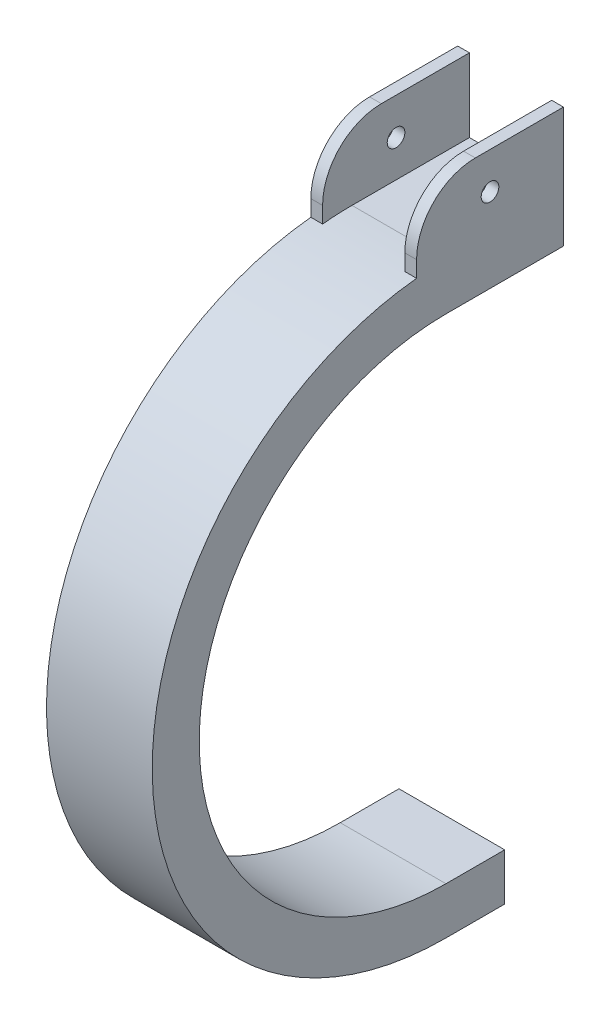
ISO-10303-21;
HEADER;
FILE_DESCRIPTION(('STEP AP214'),'2;1');
FILE_NAME('part.step','',(''),(''),'','','');
FILE_SCHEMA(('AUTOMOTIVE_DESIGN { 1 0 10303 214 1 1 1 1 }'));
ENDSEC;
DATA;
#1=APPLICATION_CONTEXT('core data for automotive mechanical design processes');
#2=APPLICATION_PROTOCOL_DEFINITION('international standard','automotive_design',2000,#1);
#3=PRODUCT_CONTEXT('',#1,'mechanical');
#4=PRODUCT('Part','Part','',(#3));
#5=PRODUCT_RELATED_PRODUCT_CATEGORY('part','',(#4));
#6=PRODUCT_DEFINITION_FORMATION('','',#4);
#7=PRODUCT_DEFINITION_CONTEXT('part definition',#1,'design');
#8=PRODUCT_DEFINITION('design','',#6,#7);
#9=PRODUCT_DEFINITION_SHAPE('','',#8);
#10=(LENGTH_UNIT() NAMED_UNIT(*) SI_UNIT(.MILLI.,.METRE.));
#11=(NAMED_UNIT(*) PLANE_ANGLE_UNIT() SI_UNIT($,.RADIAN.));
#12=(NAMED_UNIT(*) SI_UNIT($,.STERADIAN.) SOLID_ANGLE_UNIT());
#13=UNCERTAINTY_MEASURE_WITH_UNIT(LENGTH_MEASURE(1.E-05),#10,'distance_accuracy_value','');
#14=(GEOMETRIC_REPRESENTATION_CONTEXT(3) GLOBAL_UNCERTAINTY_ASSIGNED_CONTEXT((#13)) GLOBAL_UNIT_ASSIGNED_CONTEXT((#10,
#11,#12)) REPRESENTATION_CONTEXT('',''));
#15=CARTESIAN_POINT('',(0.,0.,0.));
#16=DIRECTION('',(0.,0.,1.));
#17=DIRECTION('',(1.,0.,0.));
#18=AXIS2_PLACEMENT_3D('',#15,#16,#17);
#19=CARTESIAN_POINT('',(18.,50.,0.));
#20=DIRECTION('',(0.,-1.,0.));
#21=DIRECTION('',(0.,0.,-1.));
#22=AXIS2_PLACEMENT_3D('',#19,#20,#21);
#23=PLANE('',#22);
#24=DIRECTION('',(-1.,0.,0.));
#25=VECTOR('',#24,1.);
#26=CARTESIAN_POINT('',(18.,50.,-20.));
#27=LINE('',#26,#25);
#28=CARTESIAN_POINT('',(16.,50.,-20.));
#29=VERTEX_POINT('',#28);
#30=CARTESIAN_POINT('',(2.,50.,-20.));
#31=VERTEX_POINT('',#30);
#32=EDGE_CURVE('E238',#29,#31,#27,.T.);
#33=ORIENTED_EDGE('',*,*,#32,.T.);
#34=DIRECTION('',(0.,0.,1.));
#35=VECTOR('',#34,1.);
#36=CARTESIAN_POINT('',(2.,50.,0.));
#37=LINE('',#36,#35);
#38=CARTESIAN_POINT('',(2.,50.,0.));
#39=VERTEX_POINT('',#38);
#40=EDGE_CURVE('E165',#31,#39,#37,.T.);
#41=ORIENTED_EDGE('',*,*,#40,.T.);
#42=DIRECTION('',(-1.,0.,0.));
#43=VECTOR('',#42,1.);
#44=CARTESIAN_POINT('',(18.,50.,0.));
#45=LINE('',#44,#43);
#46=CARTESIAN_POINT('',(16.,50.,0.));
#47=VERTEX_POINT('',#46);
#48=EDGE_CURVE('E235',#47,#39,#45,.T.);
#49=ORIENTED_EDGE('',*,*,#48,.F.);
#50=DIRECTION('',(0.,0.,1.));
#51=VECTOR('',#50,1.);
#52=CARTESIAN_POINT('',(16.,50.,0.));
#53=LINE('',#52,#51);
#54=EDGE_CURVE('E198',#29,#47,#53,.T.);
#55=ORIENTED_EDGE('',*,*,#54,.F.);
#56=EDGE_LOOP('',(#33,#41,#49,#55));
#57=FACE_BOUND('',#56,.T.);
#58=ADVANCED_FACE('F33',(#57),#23,.F.);
#59=CARTESIAN_POINT('',(18.,-42.,-10.));
#60=DIRECTION('',(0.,0.,1.));
#61=DIRECTION('',(0.,-1.,0.));
#62=AXIS2_PLACEMENT_3D('',#59,#60,#61);
#63=PLANE('',#62);
#64=DIRECTION('',(0.,1.,0.));
#65=VECTOR('',#64,1.);
#66=CARTESIAN_POINT('',(0.,-42.,-10.));
#67=LINE('',#66,#65);
#68=CARTESIAN_POINT('',(0.,-50.,-10.));
#69=VERTEX_POINT('',#68);
#70=CARTESIAN_POINT('',(0.,-42.,-10.));
#71=VERTEX_POINT('',#70);
#72=EDGE_CURVE('E200',#69,#71,#67,.T.);
#73=ORIENTED_EDGE('',*,*,#72,.T.);
#74=DIRECTION('',(-1.,0.,0.));
#75=VECTOR('',#74,1.);
#76=CARTESIAN_POINT('',(18.,-42.,-10.));
#77=LINE('',#76,#75);
#78=CARTESIAN_POINT('',(18.,-42.,-10.));
#79=VERTEX_POINT('',#78);
#80=EDGE_CURVE('E248',#79,#71,#77,.T.);
#81=ORIENTED_EDGE('',*,*,#80,.F.);
#82=DIRECTION('',(0.,1.,0.));
#83=VECTOR('',#82,1.);
#84=CARTESIAN_POINT('',(18.,-42.,-10.));
#85=LINE('',#84,#83);
#86=CARTESIAN_POINT('',(18.,-50.,-10.));
#87=VERTEX_POINT('',#86);
#88=EDGE_CURVE('E201',#87,#79,#85,.T.);
#89=ORIENTED_EDGE('',*,*,#88,.F.);
#90=DIRECTION('',(-1.,0.,0.));
#91=VECTOR('',#90,1.);
#92=CARTESIAN_POINT('',(18.,-50.,-10.));
#93=LINE('',#92,#91);
#94=EDGE_CURVE('E217',#87,#69,#93,.T.);
#95=ORIENTED_EDGE('',*,*,#94,.T.);
#96=EDGE_LOOP('',(#73,#81,#89,#95));
#97=FACE_BOUND('',#96,.T.);
#98=ADVANCED_FACE('F294',(#97),#63,.F.);
#99=CARTESIAN_POINT('',(18.,-42.,0.));
#100=DIRECTION('',(0.,-1.,0.));
#101=DIRECTION('',(0.,0.,-1.));
#102=AXIS2_PLACEMENT_3D('',#99,#100,#101);
#103=PLANE('',#102);
#104=DIRECTION('',(0.,0.,1.));
#105=VECTOR('',#104,1.);
#106=CARTESIAN_POINT('',(0.,-42.,0.));
#107=LINE('',#106,#105);
#108=CARTESIAN_POINT('',(0.,-42.,0.));
#109=VERTEX_POINT('',#108);
#110=EDGE_CURVE('E220',#71,#109,#107,.T.);
#111=ORIENTED_EDGE('',*,*,#110,.T.);
#112=DIRECTION('',(-1.,0.,0.));
#113=VECTOR('',#112,1.);
#114=CARTESIAN_POINT('',(18.,-42.,0.));
#115=LINE('',#114,#113);
#116=CARTESIAN_POINT('',(18.,-42.,0.));
#117=VERTEX_POINT('',#116);
#118=EDGE_CURVE('E245',#117,#109,#115,.T.);
#119=ORIENTED_EDGE('',*,*,#118,.F.);
#120=DIRECTION('',(0.,0.,1.));
#121=VECTOR('',#120,1.);
#122=CARTESIAN_POINT('',(18.,-42.,0.));
#123=LINE('',#122,#121);
#124=EDGE_CURVE('E204',#79,#117,#123,.T.);
#125=ORIENTED_EDGE('',*,*,#124,.F.);
#126=ORIENTED_EDGE('',*,*,#80,.T.);
#127=EDGE_LOOP('',(#111,#119,#125,#126));
#128=FACE_BOUND('',#127,.T.);
#129=ADVANCED_FACE('F300',(#128),#103,.F.);
#130=CARTESIAN_POINT('',(18.,0.,0.));
#131=DIRECTION('',(-1.,0.,0.));
#132=DIRECTION('',(0.,0.,1.));
#133=AXIS2_PLACEMENT_3D('',#130,#131,#132);
#134=CYLINDRICAL_SURFACE('',#133,42.);
#135=CARTESIAN_POINT('',(0.,0.,0.));
#136=DIRECTION('',(-1.,0.,0.));
#137=DIRECTION('',(0.,0.,-1.));
#138=AXIS2_PLACEMENT_3D('',#135,#136,#137);
#139=CIRCLE('',#138,42.);
#140=CARTESIAN_POINT('',(0.,42.,0.));
#141=VERTEX_POINT('',#140);
#142=EDGE_CURVE('E222',#109,#141,#139,.T.);
#143=ORIENTED_EDGE('',*,*,#142,.T.);
#144=DIRECTION('',(-1.,0.,0.));
#145=VECTOR('',#144,1.);
#146=CARTESIAN_POINT('',(18.,42.,0.));
#147=LINE('',#146,#145);
#148=CARTESIAN_POINT('',(18.,42.,0.));
#149=VERTEX_POINT('',#148);
#150=EDGE_CURVE('E242',#149,#141,#147,.T.);
#151=ORIENTED_EDGE('',*,*,#150,.F.);
#152=CARTESIAN_POINT('',(18.,0.,0.));
#153=DIRECTION('',(-1.,0.,0.));
#154=DIRECTION('',(0.,0.,-1.));
#155=AXIS2_PLACEMENT_3D('',#152,#153,#154);
#156=CIRCLE('',#155,42.);
#157=EDGE_CURVE('E207',#117,#149,#156,.T.);
#158=ORIENTED_EDGE('',*,*,#157,.F.);
#159=ORIENTED_EDGE('',*,*,#118,.T.);
#160=EDGE_LOOP('',(#143,#151,#158,#159));
#161=FACE_BOUND('',#160,.T.);
#162=ADVANCED_FACE('F311',(#161),#134,.F.);
#163=CARTESIAN_POINT('',(18.,42.,0.));
#164=DIRECTION('',(0.,1.,0.));
#165=DIRECTION('',(0.,0.,1.));
#166=AXIS2_PLACEMENT_3D('',#163,#164,#165);
#167=PLANE('',#166);
#168=DIRECTION('',(0.,0.,-1.));
#169=VECTOR('',#168,1.);
#170=CARTESIAN_POINT('',(0.,42.,0.));
#171=LINE('',#170,#169);
#172=CARTESIAN_POINT('',(0.,42.,-20.));
#173=VERTEX_POINT('',#172);
#174=EDGE_CURVE('E224',#141,#173,#171,.T.);
#175=ORIENTED_EDGE('',*,*,#174,.T.);
#176=DIRECTION('',(-1.,0.,0.));
#177=VECTOR('',#176,1.);
#178=CARTESIAN_POINT('',(18.,42.,-20.));
#179=LINE('',#178,#177);
#180=CARTESIAN_POINT('',(18.,42.,-20.));
#181=VERTEX_POINT('',#180);
#182=EDGE_CURVE('E240',#181,#173,#179,.T.);
#183=ORIENTED_EDGE('',*,*,#182,.F.);
#184=DIRECTION('',(0.,0.,-1.));
#185=VECTOR('',#184,1.);
#186=CARTESIAN_POINT('',(18.,42.,0.));
#187=LINE('',#186,#185);
#188=EDGE_CURVE('E209',#149,#181,#187,.T.);
#189=ORIENTED_EDGE('',*,*,#188,.F.);
#190=ORIENTED_EDGE('',*,*,#150,.T.);
#191=EDGE_LOOP('',(#175,#183,#189,#190));
#192=FACE_BOUND('',#191,.T.);
#193=ADVANCED_FACE('F308',(#192),#167,.F.);
#194=CARTESIAN_POINT('',(18.,50.,-20.));
#195=DIRECTION('',(0.,0.,1.));
#196=DIRECTION('',(1.,0.,0.));
#197=AXIS2_PLACEMENT_3D('',#194,#195,#196);
#198=PLANE('',#197);
#199=DIRECTION('',(0.,1.,0.));
#200=VECTOR('',#199,1.);
#201=CARTESIAN_POINT('',(0.,50.,-20.));
#202=LINE('',#201,#200);
#203=CARTESIAN_POINT('',(0.,62.5,-20.));
#204=VERTEX_POINT('',#203);
#205=EDGE_CURVE('E159',#173,#204,#202,.T.);
#206=ORIENTED_EDGE('',*,*,#205,.T.);
#207=DIRECTION('',(-1.,0.,0.));
#208=VECTOR('',#207,1.);
#209=CARTESIAN_POINT('',(2.,62.5,-20.));
#210=LINE('',#209,#208);
#211=CARTESIAN_POINT('',(2.,62.5,-20.));
#212=VERTEX_POINT('',#211);
#213=EDGE_CURVE('E145',#212,#204,#210,.T.);
#214=ORIENTED_EDGE('',*,*,#213,.F.);
#215=DIRECTION('',(0.,-1.,0.));
#216=VECTOR('',#215,1.);
#217=CARTESIAN_POINT('',(2.,46.,-20.));
#218=LINE('',#217,#216);
#219=EDGE_CURVE('E156',#212,#31,#218,.T.);
#220=ORIENTED_EDGE('',*,*,#219,.T.);
#221=ORIENTED_EDGE('',*,*,#32,.F.);
#222=DIRECTION('',(0.,1.,0.));
#223=VECTOR('',#222,1.);
#224=CARTESIAN_POINT('',(16.,46.,-20.));
#225=LINE('',#224,#223);
#226=CARTESIAN_POINT('',(16.,62.5,-20.));
#227=VERTEX_POINT('',#226);
#228=EDGE_CURVE('E181',#29,#227,#225,.T.);
#229=ORIENTED_EDGE('',*,*,#228,.T.);
#230=DIRECTION('',(1.,0.,0.));
#231=VECTOR('',#230,1.);
#232=CARTESIAN_POINT('',(16.,62.5,-20.));
#233=LINE('',#232,#231);
#234=CARTESIAN_POINT('',(18.,62.5,-20.));
#235=VERTEX_POINT('',#234);
#236=EDGE_CURVE('E189',#227,#235,#233,.T.);
#237=ORIENTED_EDGE('',*,*,#236,.T.);
#238=DIRECTION('',(0.,1.,0.));
#239=VECTOR('',#238,1.);
#240=CARTESIAN_POINT('',(18.,50.,-20.));
#241=LINE('',#240,#239);
#242=EDGE_CURVE('E211',#181,#235,#241,.T.);
#243=ORIENTED_EDGE('',*,*,#242,.F.);
#244=ORIENTED_EDGE('',*,*,#182,.T.);
#245=EDGE_LOOP('',(#206,#214,#220,#221,#229,#237,#243,#244));
#246=FACE_BOUND('',#245,.T.);
#247=ADVANCED_FACE('F154',(#246),#198,.F.);
#248=CARTESIAN_POINT('',(18.,0.,0.));
#249=DIRECTION('',(-1.,0.,0.));
#250=DIRECTION('',(0.,0.,1.));
#251=AXIS2_PLACEMENT_3D('',#248,#249,#250);
#252=CYLINDRICAL_SURFACE('',#251,50.);
#253=CARTESIAN_POINT('',(2.,0.,0.));
#254=DIRECTION('',(1.,0.,0.));
#255=DIRECTION('',(0.,0.,-1.));
#256=AXIS2_PLACEMENT_3D('',#253,#254,#255);
#257=CIRCLE('',#256,50.);
#258=CARTESIAN_POINT('',(2.,49.749371855331,5.));
#259=VERTEX_POINT('',#258);
#260=EDGE_CURVE('E254',#39,#259,#257,.T.);
#261=ORIENTED_EDGE('',*,*,#260,.T.);
#262=DIRECTION('',(-1.,0.,0.));
#263=VECTOR('',#262,1.);
#264=CARTESIAN_POINT('',(18.,49.749371855331,5.));
#265=LINE('',#264,#263);
#266=CARTESIAN_POINT('',(0.,49.749371855331,5.));
#267=VERTEX_POINT('',#266);
#268=EDGE_CURVE('E160',#259,#267,#265,.T.);
#269=ORIENTED_EDGE('',*,*,#268,.T.);
#270=CARTESIAN_POINT('',(0.,0.,0.));
#271=DIRECTION('',(1.,0.,0.));
#272=DIRECTION('',(0.,0.,-1.));
#273=AXIS2_PLACEMENT_3D('',#270,#271,#272);
#274=CIRCLE('',#273,50.);
#275=CARTESIAN_POINT('',(0.,-50.,0.));
#276=VERTEX_POINT('',#275);
#277=EDGE_CURVE('E227',#267,#276,#274,.T.);
#278=ORIENTED_EDGE('',*,*,#277,.T.);
#279=DIRECTION('',(-1.,0.,0.));
#280=VECTOR('',#279,1.);
#281=CARTESIAN_POINT('',(18.,-50.,0.));
#282=LINE('',#281,#280);
#283=CARTESIAN_POINT('',(18.,-50.,0.));
#284=VERTEX_POINT('',#283);
#285=EDGE_CURVE('E232',#284,#276,#282,.T.);
#286=ORIENTED_EDGE('',*,*,#285,.F.);
#287=CARTESIAN_POINT('',(18.,0.,0.));
#288=DIRECTION('',(1.,0.,0.));
#289=DIRECTION('',(0.,0.,-1.));
#290=AXIS2_PLACEMENT_3D('',#287,#288,#289);
#291=CIRCLE('',#290,50.);
#292=CARTESIAN_POINT('',(18.,49.749371855331,5.));
#293=VERTEX_POINT('',#292);
#294=EDGE_CURVE('E213',#293,#284,#291,.T.);
#295=ORIENTED_EDGE('',*,*,#294,.F.);
#296=DIRECTION('',(-1.,0.,0.));
#297=VECTOR('',#296,1.);
#298=CARTESIAN_POINT('',(18.,49.749371855331,5.));
#299=LINE('',#298,#297);
#300=CARTESIAN_POINT('',(16.,49.749371855331,5.));
#301=VERTEX_POINT('',#300);
#302=EDGE_CURVE('E195',#293,#301,#299,.T.);
#303=ORIENTED_EDGE('',*,*,#302,.T.);
#304=CARTESIAN_POINT('',(16.,0.,0.));
#305=DIRECTION('',(1.,0.,0.));
#306=DIRECTION('',(0.,0.,-1.));
#307=AXIS2_PLACEMENT_3D('',#304,#305,#306);
#308=CIRCLE('',#307,50.);
#309=EDGE_CURVE('E251',#47,#301,#308,.T.);
#310=ORIENTED_EDGE('',*,*,#309,.F.);
#311=ORIENTED_EDGE('',*,*,#48,.T.);
#312=EDGE_LOOP('',(#261,#269,#278,#286,#295,#303,#310,#311));
#313=FACE_BOUND('',#312,.T.);
#314=ADVANCED_FACE('F285',(#313),#252,.T.);
#315=CARTESIAN_POINT('',(18.,-50.,0.));
#316=DIRECTION('',(0.,1.,0.));
#317=DIRECTION('',(0.,0.,1.));
#318=AXIS2_PLACEMENT_3D('',#315,#316,#317);
#319=PLANE('',#318);
#320=DIRECTION('',(0.,0.,-1.));
#321=VECTOR('',#320,1.);
#322=CARTESIAN_POINT('',(0.,-50.,0.));
#323=LINE('',#322,#321);
#324=EDGE_CURVE('E205',#276,#69,#323,.T.);
#325=ORIENTED_EDGE('',*,*,#324,.T.);
#326=ORIENTED_EDGE('',*,*,#94,.F.);
#327=DIRECTION('',(0.,0.,-1.));
#328=VECTOR('',#327,1.);
#329=CARTESIAN_POINT('',(18.,-50.,0.));
#330=LINE('',#329,#328);
#331=EDGE_CURVE('E215',#284,#87,#330,.T.);
#332=ORIENTED_EDGE('',*,*,#331,.F.);
#333=ORIENTED_EDGE('',*,*,#285,.T.);
#334=EDGE_LOOP('',(#325,#326,#332,#333));
#335=FACE_BOUND('',#334,.T.);
#336=ADVANCED_FACE('F337',(#335),#319,.F.);
#337=CARTESIAN_POINT('',(18.,0.,0.));
#338=DIRECTION('',(1.,0.,0.));
#339=DIRECTION('',(0.,0.,-1.));
#340=AXIS2_PLACEMENT_3D('',#337,#338,#339);
#341=PLANE('',#340);
#342=CARTESIAN_POINT('',(18.,56.25,-7.5));
#343=DIRECTION('',(1.,0.,0.));
#344=DIRECTION('',(0.,0.,-1.));
#345=AXIS2_PLACEMENT_3D('',#342,#343,#344);
#346=CIRCLE('',#345,1.5);
#347=CARTESIAN_POINT('',(18.,56.25,-9.));
#348=VERTEX_POINT('',#347);
#349=EDGE_CURVE('E173',#348,#348,#346,.T.);
#350=ORIENTED_EDGE('',*,*,#349,.F.);
#351=EDGE_LOOP('',(#350));
#352=FACE_BOUND('',#351,.T.);
#353=DIRECTION('',(0.,0.,1.));
#354=VECTOR('',#353,1.);
#355=CARTESIAN_POINT('',(18.,62.5,-20.));
#356=LINE('',#355,#354);
#357=CARTESIAN_POINT('',(18.,62.5,-5.));
#358=VERTEX_POINT('',#357);
#359=EDGE_CURVE('E180',#235,#358,#356,.T.);
#360=ORIENTED_EDGE('',*,*,#359,.T.);
#361=CARTESIAN_POINT('',(18.,52.5,-5.));
#362=DIRECTION('',(1.,0.,0.));
#363=DIRECTION('',(0.,0.,-1.));
#364=AXIS2_PLACEMENT_3D('',#361,#362,#363);
#365=CIRCLE('',#364,10.);
#366=CARTESIAN_POINT('',(18.,52.5,5.));
#367=VERTEX_POINT('',#366);
#368=EDGE_CURVE('E264',#358,#367,#365,.T.);
#369=ORIENTED_EDGE('',*,*,#368,.T.);
#370=DIRECTION('',(0.,-1.,0.));
#371=VECTOR('',#370,1.);
#372=CARTESIAN_POINT('',(18.,46.,5.));
#373=LINE('',#372,#371);
#374=EDGE_CURVE('E184',#367,#293,#373,.T.);
#375=ORIENTED_EDGE('',*,*,#374,.T.);
#376=ORIENTED_EDGE('',*,*,#294,.T.);
#377=ORIENTED_EDGE('',*,*,#331,.T.);
#378=ORIENTED_EDGE('',*,*,#88,.T.);
#379=ORIENTED_EDGE('',*,*,#124,.T.);
#380=ORIENTED_EDGE('',*,*,#157,.T.);
#381=ORIENTED_EDGE('',*,*,#188,.T.);
#382=ORIENTED_EDGE('',*,*,#242,.T.);
#383=EDGE_LOOP('',(#360,#369,#375,#376,#377,#378,#379,#380,#381,#382));
#384=FACE_BOUND('',#383,.T.);
#385=ADVANCED_FACE('F332',(#352,#384),#341,.T.);
#386=CARTESIAN_POINT('',(0.,0.,0.));
#387=DIRECTION('',(1.,0.,0.));
#388=DIRECTION('',(0.,0.,-1.));
#389=AXIS2_PLACEMENT_3D('',#386,#387,#388);
#390=PLANE('',#389);
#391=CARTESIAN_POINT('',(0.,56.25,-7.5));
#392=DIRECTION('',(-1.,0.,0.));
#393=DIRECTION('',(0.,0.,1.));
#394=AXIS2_PLACEMENT_3D('',#391,#392,#393);
#395=CIRCLE('',#394,1.5);
#396=CARTESIAN_POINT('',(0.,56.25,-6.));
#397=VERTEX_POINT('',#396);
#398=EDGE_CURVE('E261',#397,#397,#395,.T.);
#399=ORIENTED_EDGE('',*,*,#398,.F.);
#400=EDGE_LOOP('',(#399));
#401=FACE_BOUND('',#400,.T.);
#402=DIRECTION('',(0.,1.,0.));
#403=VECTOR('',#402,1.);
#404=CARTESIAN_POINT('',(0.,46.,5.));
#405=LINE('',#404,#403);
#406=CARTESIAN_POINT('',(0.,52.5,5.));
#407=VERTEX_POINT('',#406);
#408=EDGE_CURVE('E170',#267,#407,#405,.T.);
#409=ORIENTED_EDGE('',*,*,#408,.T.);
#410=CARTESIAN_POINT('',(0.,52.5,-5.));
#411=DIRECTION('',(1.,0.,0.));
#412=DIRECTION('',(0.,0.,-1.));
#413=AXIS2_PLACEMENT_3D('',#410,#411,#412);
#414=CIRCLE('',#413,10.);
#415=CARTESIAN_POINT('',(0.,62.5,-5.));
#416=VERTEX_POINT('',#415);
#417=EDGE_CURVE('E55',#407,#416,#414,.F.);
#418=ORIENTED_EDGE('',*,*,#417,.T.);
#419=DIRECTION('',(0.,0.,-1.));
#420=VECTOR('',#419,1.);
#421=CARTESIAN_POINT('',(0.,62.5,-20.));
#422=LINE('',#421,#420);
#423=EDGE_CURVE('E166',#416,#204,#422,.T.);
#424=ORIENTED_EDGE('',*,*,#423,.T.);
#425=ORIENTED_EDGE('',*,*,#205,.F.);
#426=ORIENTED_EDGE('',*,*,#174,.F.);
#427=ORIENTED_EDGE('',*,*,#142,.F.);
#428=ORIENTED_EDGE('',*,*,#110,.F.);
#429=ORIENTED_EDGE('',*,*,#72,.F.);
#430=ORIENTED_EDGE('',*,*,#324,.F.);
#431=ORIENTED_EDGE('',*,*,#277,.F.);
#432=EDGE_LOOP('',(#409,#418,#424,#425,#426,#427,#428,#429,#430,#431));
#433=FACE_BOUND('',#432,.T.);
#434=ADVANCED_FACE('F280',(#401,#433),#390,.F.);
#435=CARTESIAN_POINT('',(16.,46.,5.));
#436=DIRECTION('',(0.,0.,1.));
#437=DIRECTION('',(1.,0.,0.));
#438=AXIS2_PLACEMENT_3D('',#435,#436,#437);
#439=PLANE('',#438);
#440=ORIENTED_EDGE('',*,*,#374,.F.);
#441=DIRECTION('',(1.,0.,0.));
#442=VECTOR('',#441,1.);
#443=CARTESIAN_POINT('',(16.,52.5,5.));
#444=LINE('',#443,#442);
#445=CARTESIAN_POINT('',(16.,52.5,5.));
#446=VERTEX_POINT('',#445);
#447=EDGE_CURVE('E266',#367,#446,#444,.F.);
#448=ORIENTED_EDGE('',*,*,#447,.T.);
#449=DIRECTION('',(0.,-1.,0.));
#450=VECTOR('',#449,1.);
#451=CARTESIAN_POINT('',(16.,46.,5.));
#452=LINE('',#451,#450);
#453=EDGE_CURVE('E187',#446,#301,#452,.T.);
#454=ORIENTED_EDGE('',*,*,#453,.T.);
#455=ORIENTED_EDGE('',*,*,#302,.F.);
#456=EDGE_LOOP('',(#440,#448,#454,#455));
#457=FACE_BOUND('',#456,.T.);
#458=ADVANCED_FACE('F344',(#457),#439,.T.);
#459=CARTESIAN_POINT('',(16.,62.5,-20.));
#460=DIRECTION('',(0.,1.,0.));
#461=DIRECTION('',(0.,0.,1.));
#462=AXIS2_PLACEMENT_3D('',#459,#460,#461);
#463=PLANE('',#462);
#464=DIRECTION('',(0.,0.,1.));
#465=VECTOR('',#464,1.);
#466=CARTESIAN_POINT('',(16.,62.5,-20.));
#467=LINE('',#466,#465);
#468=CARTESIAN_POINT('',(16.,62.5,-5.));
#469=VERTEX_POINT('',#468);
#470=EDGE_CURVE('E183',#227,#469,#467,.T.);
#471=ORIENTED_EDGE('',*,*,#470,.T.);
#472=DIRECTION('',(1.,0.,0.));
#473=VECTOR('',#472,1.);
#474=CARTESIAN_POINT('',(16.,62.5,-5.));
#475=LINE('',#474,#473);
#476=EDGE_CURVE('E256',#469,#358,#475,.T.);
#477=ORIENTED_EDGE('',*,*,#476,.T.);
#478=ORIENTED_EDGE('',*,*,#359,.F.);
#479=ORIENTED_EDGE('',*,*,#236,.F.);
#480=EDGE_LOOP('',(#471,#477,#478,#479));
#481=FACE_BOUND('',#480,.T.);
#482=ADVANCED_FACE('F353',(#481),#463,.T.);
#483=CARTESIAN_POINT('',(16.,0.,0.));
#484=DIRECTION('',(1.,0.,0.));
#485=DIRECTION('',(0.,0.,-1.));
#486=AXIS2_PLACEMENT_3D('',#483,#484,#485);
#487=PLANE('',#486);
#488=CARTESIAN_POINT('',(16.,56.25,-7.5));
#489=DIRECTION('',(1.,0.,0.));
#490=DIRECTION('',(0.,0.,-1.));
#491=AXIS2_PLACEMENT_3D('',#488,#489,#490);
#492=CIRCLE('',#491,1.5);
#493=CARTESIAN_POINT('',(16.,56.25,-9.));
#494=VERTEX_POINT('',#493);
#495=EDGE_CURVE('E260',#494,#494,#492,.T.);
#496=ORIENTED_EDGE('',*,*,#495,.T.);
#497=EDGE_LOOP('',(#496));
#498=FACE_BOUND('',#497,.T.);
#499=ORIENTED_EDGE('',*,*,#453,.F.);
#500=CARTESIAN_POINT('',(16.,52.5,-5.));
#501=DIRECTION('',(1.,0.,0.));
#502=DIRECTION('',(0.,0.,-1.));
#503=AXIS2_PLACEMENT_3D('',#500,#501,#502);
#504=CIRCLE('',#503,10.);
#505=EDGE_CURVE('E268',#446,#469,#504,.F.);
#506=ORIENTED_EDGE('',*,*,#505,.T.);
#507=ORIENTED_EDGE('',*,*,#470,.F.);
#508=ORIENTED_EDGE('',*,*,#228,.F.);
#509=ORIENTED_EDGE('',*,*,#54,.T.);
#510=ORIENTED_EDGE('',*,*,#309,.T.);
#511=EDGE_LOOP('',(#499,#506,#507,#508,#509,#510));
#512=FACE_BOUND('',#511,.T.);
#513=ADVANCED_FACE('F348',(#498,#512),#487,.F.);
#514=CARTESIAN_POINT('',(2.,46.,5.));
#515=DIRECTION('',(0.,0.,1.));
#516=DIRECTION('',(1.,0.,0.));
#517=AXIS2_PLACEMENT_3D('',#514,#515,#516);
#518=PLANE('',#517);
#519=DIRECTION('',(0.,1.,0.));
#520=VECTOR('',#519,1.);
#521=CARTESIAN_POINT('',(2.,46.,5.));
#522=LINE('',#521,#520);
#523=CARTESIAN_POINT('',(2.,52.5,5.));
#524=VERTEX_POINT('',#523);
#525=EDGE_CURVE('E149',#259,#524,#522,.T.);
#526=ORIENTED_EDGE('',*,*,#525,.T.);
#527=DIRECTION('',(-1.,0.,0.));
#528=VECTOR('',#527,1.);
#529=CARTESIAN_POINT('',(2.,52.5,5.));
#530=LINE('',#529,#528);
#531=EDGE_CURVE('E270',#524,#407,#530,.T.);
#532=ORIENTED_EDGE('',*,*,#531,.T.);
#533=ORIENTED_EDGE('',*,*,#408,.F.);
#534=ORIENTED_EDGE('',*,*,#268,.F.);
#535=EDGE_LOOP('',(#526,#532,#533,#534));
#536=FACE_BOUND('',#535,.T.);
#537=ADVANCED_FACE('F276',(#536),#518,.T.);
#538=CARTESIAN_POINT('',(2.,62.5,-20.));
#539=DIRECTION('',(0.,1.,0.));
#540=DIRECTION('',(0.,0.,1.));
#541=AXIS2_PLACEMENT_3D('',#538,#539,#540);
#542=PLANE('',#541);
#543=ORIENTED_EDGE('',*,*,#423,.F.);
#544=DIRECTION('',(-1.,0.,0.));
#545=VECTOR('',#544,1.);
#546=CARTESIAN_POINT('',(2.,62.5,-5.));
#547=LINE('',#546,#545);
#548=CARTESIAN_POINT('',(2.,62.5,-5.));
#549=VERTEX_POINT('',#548);
#550=EDGE_CURVE('E41',#416,#549,#547,.F.);
#551=ORIENTED_EDGE('',*,*,#550,.T.);
#552=DIRECTION('',(0.,0.,-1.));
#553=VECTOR('',#552,1.);
#554=CARTESIAN_POINT('',(2.,62.5,-20.));
#555=LINE('',#554,#553);
#556=EDGE_CURVE('E142',#549,#212,#555,.T.);
#557=ORIENTED_EDGE('',*,*,#556,.T.);
#558=ORIENTED_EDGE('',*,*,#213,.T.);
#559=EDGE_LOOP('',(#543,#551,#557,#558));
#560=FACE_BOUND('',#559,.T.);
#561=ADVANCED_FACE('F144',(#560),#542,.T.);
#562=CARTESIAN_POINT('',(2.,0.,0.));
#563=DIRECTION('',(1.,0.,0.));
#564=DIRECTION('',(0.,0.,-1.));
#565=AXIS2_PLACEMENT_3D('',#562,#563,#564);
#566=PLANE('',#565);
#567=CARTESIAN_POINT('',(2.,56.25,-7.5));
#568=DIRECTION('',(1.,0.,0.));
#569=DIRECTION('',(0.,0.,-1.));
#570=AXIS2_PLACEMENT_3D('',#567,#568,#569);
#571=CIRCLE('',#570,1.5);
#572=CARTESIAN_POINT('',(2.,56.25,-9.));
#573=VERTEX_POINT('',#572);
#574=EDGE_CURVE('E257',#573,#573,#571,.T.);
#575=ORIENTED_EDGE('',*,*,#574,.F.);
#576=EDGE_LOOP('',(#575));
#577=FACE_BOUND('',#576,.T.);
#578=ORIENTED_EDGE('',*,*,#556,.F.);
#579=CARTESIAN_POINT('',(2.,52.5,-5.));
#580=DIRECTION('',(1.,0.,0.));
#581=DIRECTION('',(0.,0.,-1.));
#582=AXIS2_PLACEMENT_3D('',#579,#580,#581);
#583=CIRCLE('',#582,10.);
#584=EDGE_CURVE('E11',#549,#524,#583,.T.);
#585=ORIENTED_EDGE('',*,*,#584,.T.);
#586=ORIENTED_EDGE('',*,*,#525,.F.);
#587=ORIENTED_EDGE('',*,*,#260,.F.);
#588=ORIENTED_EDGE('',*,*,#40,.F.);
#589=ORIENTED_EDGE('',*,*,#219,.F.);
#590=EDGE_LOOP('',(#578,#585,#586,#587,#588,#589));
#591=FACE_BOUND('',#590,.T.);
#592=ADVANCED_FACE('F163',(#577,#591),#566,.T.);
#593=CARTESIAN_POINT('',(32.,56.25,-7.5));
#594=DIRECTION('',(-1.,0.,0.));
#595=DIRECTION('',(0.,0.,1.));
#596=AXIS2_PLACEMENT_3D('',#593,#594,#595);
#597=CYLINDRICAL_SURFACE('',#596,1.5);
#598=ORIENTED_EDGE('',*,*,#574,.T.);
#599=EDGE_LOOP('',(#598));
#600=FACE_BOUND('',#599,.T.);
#601=ORIENTED_EDGE('',*,*,#398,.T.);
#602=EDGE_LOOP('',(#601));
#603=FACE_BOUND('',#602,.T.);
#604=ADVANCED_FACE('F462',(#600,#603),#597,.F.);
#605=ORIENTED_EDGE('',*,*,#349,.T.);
#606=EDGE_LOOP('',(#605));
#607=FACE_BOUND('',#606,.T.);
#608=ORIENTED_EDGE('',*,*,#495,.F.);
#609=EDGE_LOOP('',(#608));
#610=FACE_BOUND('',#609,.T.);
#611=ADVANCED_FACE('F291',(#607,#610),#597,.F.);
#612=CARTESIAN_POINT('',(16.,52.5,-5.));
#613=DIRECTION('',(1.,0.,0.));
#614=DIRECTION('',(0.,0.,-1.));
#615=AXIS2_PLACEMENT_3D('',#612,#613,#614);
#616=CYLINDRICAL_SURFACE('',#615,10.);
#617=ORIENTED_EDGE('',*,*,#505,.F.);
#618=ORIENTED_EDGE('',*,*,#447,.F.);
#619=ORIENTED_EDGE('',*,*,#368,.F.);
#620=ORIENTED_EDGE('',*,*,#476,.F.);
#621=EDGE_LOOP('',(#617,#618,#619,#620));
#622=FACE_BOUND('',#621,.T.);
#623=ADVANCED_FACE('F287',(#622),#616,.T.);
#624=CARTESIAN_POINT('',(2.,52.5,-5.));
#625=DIRECTION('',(-1.,0.,0.));
#626=DIRECTION('',(0.,0.,1.));
#627=AXIS2_PLACEMENT_3D('',#624,#625,#626);
#628=CYLINDRICAL_SURFACE('',#627,10.);
#629=ORIENTED_EDGE('',*,*,#584,.F.);
#630=ORIENTED_EDGE('',*,*,#550,.F.);
#631=ORIENTED_EDGE('',*,*,#417,.F.);
#632=ORIENTED_EDGE('',*,*,#531,.F.);
#633=EDGE_LOOP('',(#629,#630,#631,#632));
#634=FACE_BOUND('',#633,.T.);
#635=ADVANCED_FACE('F35',(#634),#628,.T.);
#636=CLOSED_SHELL('',(#58,#98,#129,#162,#193,#247,#314,#336,#385,#434,#458,#482,#513,#537,#561,
#592,#604,#611,#623,#635));
#637=MANIFOLD_SOLID_BREP('B2',#636);
#638=ADVANCED_BREP_SHAPE_REPRESENTATION('',(#18,#637),#14);
#639=SHAPE_DEFINITION_REPRESENTATION(#9,#638);
ENDSEC;
END-ISO-10303-21;
